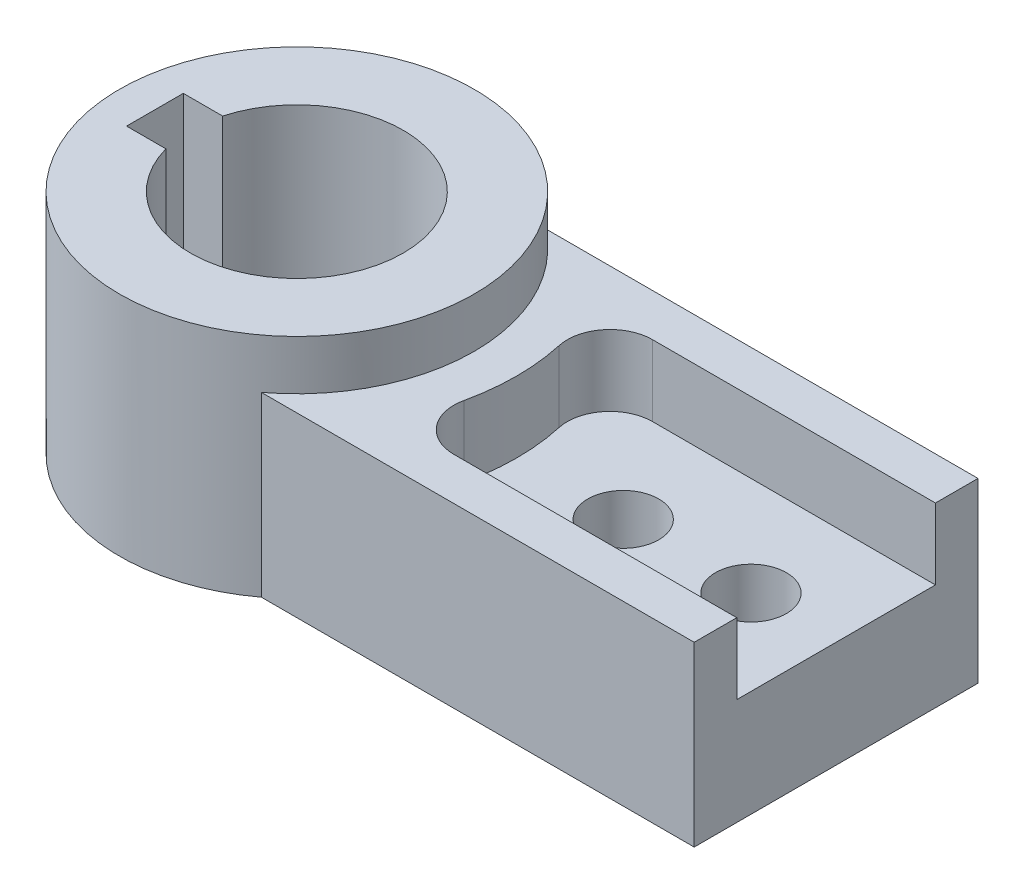
ISO-10303-21;
HEADER;
FILE_DESCRIPTION(('STEP AP214'),'2;1');
FILE_NAME('part.step','',(''),(''),'','','');
FILE_SCHEMA(('AUTOMOTIVE_DESIGN { 1 0 10303 214 1 1 1 1 }'));
ENDSEC;
DATA;
#1=APPLICATION_CONTEXT('core data for automotive mechanical design processes');
#2=APPLICATION_PROTOCOL_DEFINITION('international standard','automotive_design',2000,#1);
#3=PRODUCT_CONTEXT('',#1,'mechanical');
#4=PRODUCT('Part','Part','',(#3));
#5=PRODUCT_RELATED_PRODUCT_CATEGORY('part','',(#4));
#6=PRODUCT_DEFINITION_FORMATION('','',#4);
#7=PRODUCT_DEFINITION_CONTEXT('part definition',#1,'design');
#8=PRODUCT_DEFINITION('design','',#6,#7);
#9=PRODUCT_DEFINITION_SHAPE('','',#8);
#10=(LENGTH_UNIT() NAMED_UNIT(*) SI_UNIT(.MILLI.,.METRE.));
#11=(NAMED_UNIT(*) PLANE_ANGLE_UNIT() SI_UNIT($,.RADIAN.));
#12=(NAMED_UNIT(*) SI_UNIT($,.STERADIAN.) SOLID_ANGLE_UNIT());
#13=UNCERTAINTY_MEASURE_WITH_UNIT(LENGTH_MEASURE(1.E-05),#10,'distance_accuracy_value','');
#14=(GEOMETRIC_REPRESENTATION_CONTEXT(3) GLOBAL_UNCERTAINTY_ASSIGNED_CONTEXT((#13)) GLOBAL_UNIT_ASSIGNED_CONTEXT((#10,
#11,#12)) REPRESENTATION_CONTEXT('',''));
#15=CARTESIAN_POINT('',(0.,0.,0.));
#16=DIRECTION('',(0.,0.,1.));
#17=DIRECTION('',(1.,0.,0.));
#18=AXIS2_PLACEMENT_3D('',#15,#16,#17);
#19=CARTESIAN_POINT('',(0.,32.,0.));
#20=DIRECTION('',(0.,-1.,0.));
#21=DIRECTION('',(0.,0.,-1.));
#22=AXIS2_PLACEMENT_3D('',#19,#20,#21);
#23=CYLINDRICAL_SURFACE('',#22,25.);
#24=CARTESIAN_POINT('',(0.,32.,0.));
#25=DIRECTION('',(0.,1.,0.));
#26=DIRECTION('',(0.,0.,1.));
#27=AXIS2_PLACEMENT_3D('',#24,#25,#26);
#28=CIRCLE('',#27,25.);
#29=CARTESIAN_POINT('',(0.,32.,25.));
#30=VERTEX_POINT('',#29);
#31=EDGE_CURVE('E182',#30,#30,#28,.T.);
#32=ORIENTED_EDGE('',*,*,#31,.F.);
#33=EDGE_LOOP('',(#32));
#34=FACE_BOUND('',#33,.T.);
#35=DIRECTION('',(0.,-1.,0.));
#36=VECTOR('',#35,1.);
#37=CARTESIAN_POINT('',(15.,25.,-20.));
#38=LINE('',#37,#36);
#39=CARTESIAN_POINT('',(15.,25.,-20.));
#40=VERTEX_POINT('',#39);
#41=CARTESIAN_POINT('',(15.,0.,-20.));
#42=VERTEX_POINT('',#41);
#43=EDGE_CURVE('E228',#40,#42,#38,.T.);
#44=ORIENTED_EDGE('',*,*,#43,.T.);
#45=CARTESIAN_POINT('',(0.,0.,0.));
#46=DIRECTION('',(0.,1.,0.));
#47=DIRECTION('',(0.,0.,1.));
#48=AXIS2_PLACEMENT_3D('',#45,#46,#47);
#49=CIRCLE('',#48,25.);
#50=CARTESIAN_POINT('',(15.,0.,20.));
#51=VERTEX_POINT('',#50);
#52=EDGE_CURVE('E174',#42,#51,#49,.T.);
#53=ORIENTED_EDGE('',*,*,#52,.T.);
#54=DIRECTION('',(0.,-1.,0.));
#55=VECTOR('',#54,1.);
#56=CARTESIAN_POINT('',(15.,25.,20.));
#57=LINE('',#56,#55);
#58=CARTESIAN_POINT('',(15.,25.,20.));
#59=VERTEX_POINT('',#58);
#60=EDGE_CURVE('E237',#59,#51,#57,.T.);
#61=ORIENTED_EDGE('',*,*,#60,.F.);
#62=CARTESIAN_POINT('',(0.,25.,0.));
#63=DIRECTION('',(0.,1.,0.));
#64=DIRECTION('',(0.,0.,1.));
#65=AXIS2_PLACEMENT_3D('',#62,#63,#64);
#66=CIRCLE('',#65,25.);
#67=EDGE_CURVE('E232',#59,#40,#66,.T.);
#68=ORIENTED_EDGE('',*,*,#67,.T.);
#69=EDGE_LOOP('',(#44,#53,#61,#68));
#70=FACE_BOUND('',#69,.T.);
#71=ADVANCED_FACE('F41',(#34,#70),#23,.T.);
#72=CARTESIAN_POINT('',(0.,32.,4.));
#73=DIRECTION('',(0.,0.,-1.));
#74=DIRECTION('',(-1.,0.,0.));
#75=AXIS2_PLACEMENT_3D('',#72,#73,#74);
#76=PLANE('',#75);
#77=DIRECTION('',(1.,0.,0.));
#78=VECTOR('',#77,1.);
#79=CARTESIAN_POINT('',(0.,0.,4.));
#80=LINE('',#79,#78);
#81=CARTESIAN_POINT('',(-20.,0.,4.));
#82=VERTEX_POINT('',#81);
#83=CARTESIAN_POINT('',(-14.456832294801,0.,4.));
#84=VERTEX_POINT('',#83);
#85=EDGE_CURVE('E161',#82,#84,#80,.T.);
#86=ORIENTED_EDGE('',*,*,#85,.F.);
#87=DIRECTION('',(0.,-1.,0.));
#88=VECTOR('',#87,1.);
#89=CARTESIAN_POINT('',(-20.,32.,4.));
#90=LINE('',#89,#88);
#91=CARTESIAN_POINT('',(-20.,32.,4.));
#92=VERTEX_POINT('',#91);
#93=EDGE_CURVE('E11',#92,#82,#90,.T.);
#94=ORIENTED_EDGE('',*,*,#93,.F.);
#95=DIRECTION('',(1.,0.,0.));
#96=VECTOR('',#95,1.);
#97=CARTESIAN_POINT('',(0.,32.,4.));
#98=LINE('',#97,#96);
#99=CARTESIAN_POINT('',(-14.456832294801,32.,4.));
#100=VERTEX_POINT('',#99);
#101=EDGE_CURVE('E170',#92,#100,#98,.T.);
#102=ORIENTED_EDGE('',*,*,#101,.T.);
#103=DIRECTION('',(0.,-1.,0.));
#104=VECTOR('',#103,1.);
#105=CARTESIAN_POINT('',(-14.456832294801,32.,4.));
#106=LINE('',#105,#104);
#107=EDGE_CURVE('E184',#100,#84,#106,.T.);
#108=ORIENTED_EDGE('',*,*,#107,.T.);
#109=EDGE_LOOP('',(#86,#94,#102,#108));
#110=FACE_BOUND('',#109,.T.);
#111=ADVANCED_FACE('F43',(#110),#76,.T.);
#112=CARTESIAN_POINT('',(-20.,32.,0.));
#113=DIRECTION('',(1.,0.,0.));
#114=DIRECTION('',(0.,0.,-1.));
#115=AXIS2_PLACEMENT_3D('',#112,#113,#114);
#116=PLANE('',#115);
#117=DIRECTION('',(0.,0.,1.));
#118=VECTOR('',#117,1.);
#119=CARTESIAN_POINT('',(-20.,0.,0.));
#120=LINE('',#119,#118);
#121=CARTESIAN_POINT('',(-20.,0.,-4.));
#122=VERTEX_POINT('',#121);
#123=EDGE_CURVE('E164',#122,#82,#120,.T.);
#124=ORIENTED_EDGE('',*,*,#123,.F.);
#125=DIRECTION('',(0.,-1.,0.));
#126=VECTOR('',#125,1.);
#127=CARTESIAN_POINT('',(-20.,32.,-4.));
#128=LINE('',#127,#126);
#129=CARTESIAN_POINT('',(-20.,32.,-4.));
#130=VERTEX_POINT('',#129);
#131=EDGE_CURVE('E49',#130,#122,#128,.T.);
#132=ORIENTED_EDGE('',*,*,#131,.F.);
#133=DIRECTION('',(0.,0.,1.));
#134=VECTOR('',#133,1.);
#135=CARTESIAN_POINT('',(-20.,32.,0.));
#136=LINE('',#135,#134);
#137=EDGE_CURVE('E173',#130,#92,#136,.T.);
#138=ORIENTED_EDGE('',*,*,#137,.T.);
#139=ORIENTED_EDGE('',*,*,#93,.T.);
#140=EDGE_LOOP('',(#124,#132,#138,#139));
#141=FACE_BOUND('',#140,.T.);
#142=ADVANCED_FACE('F209',(#141),#116,.T.);
#143=CARTESIAN_POINT('',(0.,32.,-4.));
#144=DIRECTION('',(0.,0.,-1.));
#145=DIRECTION('',(-1.,0.,0.));
#146=AXIS2_PLACEMENT_3D('',#143,#144,#145);
#147=PLANE('',#146);
#148=DIRECTION('',(1.,0.,0.));
#149=VECTOR('',#148,1.);
#150=CARTESIAN_POINT('',(0.,0.,-4.));
#151=LINE('',#150,#149);
#152=CARTESIAN_POINT('',(-14.456832294801,0.,-4.));
#153=VERTEX_POINT('',#152);
#154=EDGE_CURVE('E188',#122,#153,#151,.T.);
#155=ORIENTED_EDGE('',*,*,#154,.T.);
#156=DIRECTION('',(0.,-1.,0.));
#157=VECTOR('',#156,1.);
#158=CARTESIAN_POINT('',(-14.456832294801,32.,-4.));
#159=LINE('',#158,#157);
#160=CARTESIAN_POINT('',(-14.456832294801,32.,-4.));
#161=VERTEX_POINT('',#160);
#162=EDGE_CURVE('E196',#161,#153,#159,.T.);
#163=ORIENTED_EDGE('',*,*,#162,.F.);
#164=DIRECTION('',(1.,0.,0.));
#165=VECTOR('',#164,1.);
#166=CARTESIAN_POINT('',(0.,32.,-4.));
#167=LINE('',#166,#165);
#168=EDGE_CURVE('E177',#130,#161,#167,.T.);
#169=ORIENTED_EDGE('',*,*,#168,.F.);
#170=ORIENTED_EDGE('',*,*,#131,.T.);
#171=EDGE_LOOP('',(#155,#163,#169,#170));
#172=FACE_BOUND('',#171,.T.);
#173=ADVANCED_FACE('F200',(#172),#147,.F.);
#174=CARTESIAN_POINT('',(0.,32.,0.));
#175=DIRECTION('',(0.,-1.,0.));
#176=DIRECTION('',(0.,0.,-1.));
#177=AXIS2_PLACEMENT_3D('',#174,#175,#176);
#178=CYLINDRICAL_SURFACE('',#177,15.);
#179=CARTESIAN_POINT('',(0.,0.,0.));
#180=DIRECTION('',(0.,1.,0.));
#181=DIRECTION('',(0.,0.,1.));
#182=AXIS2_PLACEMENT_3D('',#179,#180,#181);
#183=CIRCLE('',#182,15.);
#184=EDGE_CURVE('E191',#84,#153,#183,.T.);
#185=ORIENTED_EDGE('',*,*,#184,.F.);
#186=ORIENTED_EDGE('',*,*,#107,.F.);
#187=CARTESIAN_POINT('',(0.,32.,0.));
#188=DIRECTION('',(0.,1.,0.));
#189=DIRECTION('',(0.,0.,1.));
#190=AXIS2_PLACEMENT_3D('',#187,#188,#189);
#191=CIRCLE('',#190,15.);
#192=EDGE_CURVE('E179',#100,#161,#191,.T.);
#193=ORIENTED_EDGE('',*,*,#192,.T.);
#194=ORIENTED_EDGE('',*,*,#162,.T.);
#195=EDGE_LOOP('',(#185,#186,#193,#194));
#196=FACE_BOUND('',#195,.T.);
#197=ADVANCED_FACE('F214',(#196),#178,.F.);
#198=CARTESIAN_POINT('',(0.,32.,0.));
#199=DIRECTION('',(0.,1.,0.));
#200=DIRECTION('',(0.,0.,1.));
#201=AXIS2_PLACEMENT_3D('',#198,#199,#200);
#202=PLANE('',#201);
#203=ORIENTED_EDGE('',*,*,#101,.F.);
#204=ORIENTED_EDGE('',*,*,#137,.F.);
#205=ORIENTED_EDGE('',*,*,#168,.T.);
#206=ORIENTED_EDGE('',*,*,#192,.F.);
#207=EDGE_LOOP('',(#203,#204,#205,#206));
#208=FACE_BOUND('',#207,.T.);
#209=ORIENTED_EDGE('',*,*,#31,.T.);
#210=EDGE_LOOP('',(#209));
#211=FACE_BOUND('',#210,.T.);
#212=ADVANCED_FACE('F217',(#208,#211),#202,.T.);
#213=CARTESIAN_POINT('',(0.,0.,0.));
#214=DIRECTION('',(0.,1.,0.));
#215=DIRECTION('',(0.,0.,1.));
#216=AXIS2_PLACEMENT_3D('',#213,#214,#215);
#217=PLANE('',#216);
#218=ORIENTED_EDGE('',*,*,#85,.T.);
#219=ORIENTED_EDGE('',*,*,#184,.T.);
#220=ORIENTED_EDGE('',*,*,#154,.F.);
#221=ORIENTED_EDGE('',*,*,#123,.T.);
#222=EDGE_LOOP('',(#218,#219,#220,#221));
#223=FACE_BOUND('',#222,.T.);
#224=ORIENTED_EDGE('',*,*,#52,.F.);
#225=DIRECTION('',(-1.,0.,0.));
#226=VECTOR('',#225,1.);
#227=CARTESIAN_POINT('',(0.,0.,-20.));
#228=LINE('',#227,#226);
#229=CARTESIAN_POINT('',(76.,0.,-20.));
#230=VERTEX_POINT('',#229);
#231=EDGE_CURVE('E241',#230,#42,#228,.T.);
#232=ORIENTED_EDGE('',*,*,#231,.F.);
#233=DIRECTION('',(0.,0.,1.));
#234=VECTOR('',#233,1.);
#235=CARTESIAN_POINT('',(76.,0.,0.));
#236=LINE('',#235,#234);
#237=CARTESIAN_POINT('',(76.,0.,20.));
#238=VERTEX_POINT('',#237);
#239=EDGE_CURVE('E158',#230,#238,#236,.T.);
#240=ORIENTED_EDGE('',*,*,#239,.T.);
#241=DIRECTION('',(-1.,0.,0.));
#242=VECTOR('',#241,1.);
#243=CARTESIAN_POINT('',(0.,0.,20.));
#244=LINE('',#243,#242);
#245=EDGE_CURVE('E244',#238,#51,#244,.T.);
#246=ORIENTED_EDGE('',*,*,#245,.T.);
#247=EDGE_LOOP('',(#224,#232,#240,#246));
#248=FACE_BOUND('',#247,.T.);
#249=CARTESIAN_POINT('',(64.,0.,0.));
#250=DIRECTION('',(0.,1.,0.));
#251=DIRECTION('',(0.,0.,1.));
#252=AXIS2_PLACEMENT_3D('',#249,#250,#251);
#253=CIRCLE('',#252,5.);
#254=CARTESIAN_POINT('',(64.,0.,5.));
#255=VERTEX_POINT('',#254);
#256=EDGE_CURVE('E295',#255,#255,#253,.T.);
#257=ORIENTED_EDGE('',*,*,#256,.T.);
#258=EDGE_LOOP('',(#257));
#259=FACE_BOUND('',#258,.T.);
#260=CARTESIAN_POINT('',(46.,0.,0.));
#261=DIRECTION('',(0.,1.,0.));
#262=DIRECTION('',(0.,0.,1.));
#263=AXIS2_PLACEMENT_3D('',#260,#261,#262);
#264=CIRCLE('',#263,5.);
#265=CARTESIAN_POINT('',(46.,0.,5.));
#266=VERTEX_POINT('',#265);
#267=EDGE_CURVE('E286',#266,#266,#264,.T.);
#268=ORIENTED_EDGE('',*,*,#267,.T.);
#269=EDGE_LOOP('',(#268));
#270=FACE_BOUND('',#269,.T.);
#271=ADVANCED_FACE('F206',(#223,#248,#259,#270),#217,.F.);
#272=CARTESIAN_POINT('',(36.1247837363769,25.,7.99999999999999));
#273=DIRECTION('',(0.,-1.,0.));
#274=DIRECTION('',(0.,0.,-1.));
#275=AXIS2_PLACEMENT_3D('',#272,#273,#274);
#276=CYLINDRICAL_SURFACE('',#275,6.);
#277=DIRECTION('',(0.,-1.,0.));
#278=VECTOR('',#277,1.);
#279=CARTESIAN_POINT('',(36.1247837363769,25.,14.));
#280=LINE('',#279,#278);
#281=CARTESIAN_POINT('',(36.1247837363769,25.,14.));
#282=VERTEX_POINT('',#281);
#283=CARTESIAN_POINT('',(36.1247837363769,15.,14.));
#284=VERTEX_POINT('',#283);
#285=EDGE_CURVE('E256',#282,#284,#280,.T.);
#286=ORIENTED_EDGE('',*,*,#285,.T.);
#287=CARTESIAN_POINT('',(36.1247837363769,15.,7.99999999999999));
#288=DIRECTION('',(0.,1.,0.));
#289=DIRECTION('',(0.,0.,1.));
#290=AXIS2_PLACEMENT_3D('',#287,#288,#289);
#291=CIRCLE('',#290,6.);
#292=CARTESIAN_POINT('',(30.2667106980455,15.,6.7027027027027));
#293=VERTEX_POINT('',#292);
#294=EDGE_CURVE('E56',#284,#293,#291,.F.);
#295=ORIENTED_EDGE('',*,*,#294,.T.);
#296=DIRECTION('',(0.,-1.,0.));
#297=VECTOR('',#296,1.);
#298=CARTESIAN_POINT('',(30.2667106980455,25.,6.7027027027027));
#299=LINE('',#298,#297);
#300=CARTESIAN_POINT('',(30.2667106980455,25.,6.7027027027027));
#301=VERTEX_POINT('',#300);
#302=EDGE_CURVE('E144',#301,#293,#299,.T.);
#303=ORIENTED_EDGE('',*,*,#302,.F.);
#304=CARTESIAN_POINT('',(36.1247837363769,25.,7.99999999999999));
#305=DIRECTION('',(0.,1.,0.));
#306=DIRECTION('',(0.,0.,1.));
#307=AXIS2_PLACEMENT_3D('',#304,#305,#306);
#308=CIRCLE('',#307,6.);
#309=EDGE_CURVE('E150',#282,#301,#308,.F.);
#310=ORIENTED_EDGE('',*,*,#309,.F.);
#311=EDGE_LOOP('',(#286,#295,#303,#310));
#312=FACE_BOUND('',#311,.T.);
#313=ADVANCED_FACE('F160',(#312),#276,.F.);
#314=CARTESIAN_POINT('',(0.,25.,0.));
#315=DIRECTION('',(0.,-1.,0.));
#316=DIRECTION('',(0.,0.,-1.));
#317=AXIS2_PLACEMENT_3D('',#314,#315,#316);
#318=CYLINDRICAL_SURFACE('',#317,31.);
#319=ORIENTED_EDGE('',*,*,#302,.T.);
#320=CARTESIAN_POINT('',(0.,15.,0.));
#321=DIRECTION('',(0.,1.,0.));
#322=DIRECTION('',(0.,0.,1.));
#323=AXIS2_PLACEMENT_3D('',#320,#321,#322);
#324=CIRCLE('',#323,31.);
#325=CARTESIAN_POINT('',(30.2667106980455,15.,-6.7027027027027));
#326=VERTEX_POINT('',#325);
#327=EDGE_CURVE('E63',#293,#326,#324,.T.);
#328=ORIENTED_EDGE('',*,*,#327,.T.);
#329=DIRECTION('',(0.,-1.,0.));
#330=VECTOR('',#329,1.);
#331=CARTESIAN_POINT('',(30.2667106980455,25.,-6.7027027027027));
#332=LINE('',#331,#330);
#333=CARTESIAN_POINT('',(30.2667106980455,25.,-6.7027027027027));
#334=VERTEX_POINT('',#333);
#335=EDGE_CURVE('E145',#334,#326,#332,.T.);
#336=ORIENTED_EDGE('',*,*,#335,.F.);
#337=CARTESIAN_POINT('',(0.,25.,0.));
#338=DIRECTION('',(0.,1.,0.));
#339=DIRECTION('',(0.,0.,1.));
#340=AXIS2_PLACEMENT_3D('',#337,#338,#339);
#341=CIRCLE('',#340,31.);
#342=EDGE_CURVE('E141',#301,#334,#341,.T.);
#343=ORIENTED_EDGE('',*,*,#342,.F.);
#344=EDGE_LOOP('',(#319,#328,#336,#343));
#345=FACE_BOUND('',#344,.T.);
#346=ADVANCED_FACE('F143',(#345),#318,.T.);
#347=CARTESIAN_POINT('',(36.1247837363769,25.,-7.99999999999999));
#348=DIRECTION('',(0.,-1.,0.));
#349=DIRECTION('',(0.,0.,-1.));
#350=AXIS2_PLACEMENT_3D('',#347,#348,#349);
#351=CYLINDRICAL_SURFACE('',#350,6.);
#352=CARTESIAN_POINT('',(36.1247837363769,15.,-7.99999999999999));
#353=DIRECTION('',(0.,1.,0.));
#354=DIRECTION('',(0.,0.,1.));
#355=AXIS2_PLACEMENT_3D('',#352,#353,#354);
#356=CIRCLE('',#355,6.);
#357=CARTESIAN_POINT('',(36.1247837363769,15.,-14.));
#358=VERTEX_POINT('',#357);
#359=EDGE_CURVE('E280',#358,#326,#356,.T.);
#360=ORIENTED_EDGE('',*,*,#359,.F.);
#361=DIRECTION('',(0.,-1.,0.));
#362=VECTOR('',#361,1.);
#363=CARTESIAN_POINT('',(36.1247837363769,25.,-14.));
#364=LINE('',#363,#362);
#365=CARTESIAN_POINT('',(36.1247837363769,25.,-14.));
#366=VERTEX_POINT('',#365);
#367=EDGE_CURVE('E166',#366,#358,#364,.T.);
#368=ORIENTED_EDGE('',*,*,#367,.F.);
#369=CARTESIAN_POINT('',(36.1247837363769,25.,-7.99999999999999));
#370=DIRECTION('',(0.,1.,0.));
#371=DIRECTION('',(0.,0.,1.));
#372=AXIS2_PLACEMENT_3D('',#369,#370,#371);
#373=CIRCLE('',#372,6.);
#374=EDGE_CURVE('E149',#366,#334,#373,.T.);
#375=ORIENTED_EDGE('',*,*,#374,.T.);
#376=ORIENTED_EDGE('',*,*,#335,.T.);
#377=EDGE_LOOP('',(#360,#368,#375,#376));
#378=FACE_BOUND('',#377,.T.);
#379=ADVANCED_FACE('F320',(#378),#351,.F.);
#380=CARTESIAN_POINT('',(0.,25.,-14.));
#381=DIRECTION('',(0.,0.,1.));
#382=DIRECTION('',(1.,0.,0.));
#383=AXIS2_PLACEMENT_3D('',#380,#381,#382);
#384=PLANE('',#383);
#385=DIRECTION('',(-1.,0.,0.));
#386=VECTOR('',#385,1.);
#387=CARTESIAN_POINT('',(0.,15.,-14.));
#388=LINE('',#387,#386);
#389=CARTESIAN_POINT('',(76.,15.,-14.));
#390=VERTEX_POINT('',#389);
#391=EDGE_CURVE('E271',#390,#358,#388,.T.);
#392=ORIENTED_EDGE('',*,*,#391,.F.);
#393=DIRECTION('',(0.,-1.,0.));
#394=VECTOR('',#393,1.);
#395=CARTESIAN_POINT('',(76.,25.,-14.));
#396=LINE('',#395,#394);
#397=CARTESIAN_POINT('',(76.,25.,-14.));
#398=VERTEX_POINT('',#397);
#399=EDGE_CURVE('E264',#398,#390,#396,.T.);
#400=ORIENTED_EDGE('',*,*,#399,.F.);
#401=DIRECTION('',(-1.,0.,0.));
#402=VECTOR('',#401,1.);
#403=CARTESIAN_POINT('',(0.,25.,-14.));
#404=LINE('',#403,#402);
#405=EDGE_CURVE('E273',#398,#366,#404,.T.);
#406=ORIENTED_EDGE('',*,*,#405,.T.);
#407=ORIENTED_EDGE('',*,*,#367,.T.);
#408=EDGE_LOOP('',(#392,#400,#406,#407));
#409=FACE_BOUND('',#408,.T.);
#410=ADVANCED_FACE('F270',(#409),#384,.T.);
#411=CARTESIAN_POINT('',(76.,25.,0.));
#412=DIRECTION('',(1.,0.,0.));
#413=DIRECTION('',(0.,0.,-1.));
#414=AXIS2_PLACEMENT_3D('',#411,#412,#413);
#415=PLANE('',#414);
#416=ORIENTED_EDGE('',*,*,#239,.F.);
#417=DIRECTION('',(0.,-1.,0.));
#418=VECTOR('',#417,1.);
#419=CARTESIAN_POINT('',(76.,25.,-20.));
#420=LINE('',#419,#418);
#421=CARTESIAN_POINT('',(76.,25.,-20.));
#422=VERTEX_POINT('',#421);
#423=EDGE_CURVE('E236',#422,#230,#420,.T.);
#424=ORIENTED_EDGE('',*,*,#423,.F.);
#425=DIRECTION('',(0.,0.,1.));
#426=VECTOR('',#425,1.);
#427=CARTESIAN_POINT('',(76.,25.,0.));
#428=LINE('',#427,#426);
#429=EDGE_CURVE('E302',#422,#398,#428,.T.);
#430=ORIENTED_EDGE('',*,*,#429,.T.);
#431=ORIENTED_EDGE('',*,*,#399,.T.);
#432=DIRECTION('',(0.,0.,1.));
#433=VECTOR('',#432,1.);
#434=CARTESIAN_POINT('',(76.,15.,0.));
#435=LINE('',#434,#433);
#436=CARTESIAN_POINT('',(76.,15.,14.));
#437=VERTEX_POINT('',#436);
#438=EDGE_CURVE('E283',#390,#437,#435,.T.);
#439=ORIENTED_EDGE('',*,*,#438,.T.);
#440=DIRECTION('',(0.,-1.,0.));
#441=VECTOR('',#440,1.);
#442=CARTESIAN_POINT('',(76.,25.,14.));
#443=LINE('',#442,#441);
#444=CARTESIAN_POINT('',(76.,25.,14.));
#445=VERTEX_POINT('',#444);
#446=EDGE_CURVE('E258',#445,#437,#443,.T.);
#447=ORIENTED_EDGE('',*,*,#446,.F.);
#448=DIRECTION('',(0.,0.,1.));
#449=VECTOR('',#448,1.);
#450=CARTESIAN_POINT('',(76.,25.,0.));
#451=LINE('',#450,#449);
#452=CARTESIAN_POINT('',(76.,25.,20.));
#453=VERTEX_POINT('',#452);
#454=EDGE_CURVE('E310',#445,#453,#451,.T.);
#455=ORIENTED_EDGE('',*,*,#454,.T.);
#456=DIRECTION('',(0.,-1.,0.));
#457=VECTOR('',#456,1.);
#458=CARTESIAN_POINT('',(76.,25.,20.));
#459=LINE('',#458,#457);
#460=EDGE_CURVE('E260',#453,#238,#459,.T.);
#461=ORIENTED_EDGE('',*,*,#460,.T.);
#462=EDGE_LOOP('',(#416,#424,#430,#431,#439,#447,#455,#461));
#463=FACE_BOUND('',#462,.T.);
#464=ADVANCED_FACE('F313',(#463),#415,.T.);
#465=CARTESIAN_POINT('',(0.,25.,-20.));
#466=DIRECTION('',(0.,0.,1.));
#467=DIRECTION('',(1.,0.,0.));
#468=AXIS2_PLACEMENT_3D('',#465,#466,#467);
#469=PLANE('',#468);
#470=ORIENTED_EDGE('',*,*,#231,.T.);
#471=ORIENTED_EDGE('',*,*,#43,.F.);
#472=DIRECTION('',(-1.,0.,0.));
#473=VECTOR('',#472,1.);
#474=CARTESIAN_POINT('',(0.,25.,-20.));
#475=LINE('',#474,#473);
#476=EDGE_CURVE('E305',#422,#40,#475,.T.);
#477=ORIENTED_EDGE('',*,*,#476,.F.);
#478=ORIENTED_EDGE('',*,*,#423,.T.);
#479=EDGE_LOOP('',(#470,#471,#477,#478));
#480=FACE_BOUND('',#479,.T.);
#481=ADVANCED_FACE('F242',(#480),#469,.F.);
#482=CARTESIAN_POINT('',(0.,25.,20.));
#483=DIRECTION('',(0.,0.,1.));
#484=DIRECTION('',(1.,0.,0.));
#485=AXIS2_PLACEMENT_3D('',#482,#483,#484);
#486=PLANE('',#485);
#487=ORIENTED_EDGE('',*,*,#245,.F.);
#488=ORIENTED_EDGE('',*,*,#460,.F.);
#489=DIRECTION('',(-1.,0.,0.));
#490=VECTOR('',#489,1.);
#491=CARTESIAN_POINT('',(0.,25.,20.));
#492=LINE('',#491,#490);
#493=EDGE_CURVE('E308',#453,#59,#492,.T.);
#494=ORIENTED_EDGE('',*,*,#493,.T.);
#495=ORIENTED_EDGE('',*,*,#60,.T.);
#496=EDGE_LOOP('',(#487,#488,#494,#495));
#497=FACE_BOUND('',#496,.T.);
#498=ADVANCED_FACE('F317',(#497),#486,.T.);
#499=CARTESIAN_POINT('',(0.,25.,14.));
#500=DIRECTION('',(0.,0.,1.));
#501=DIRECTION('',(1.,0.,0.));
#502=AXIS2_PLACEMENT_3D('',#499,#500,#501);
#503=PLANE('',#502);
#504=ORIENTED_EDGE('',*,*,#446,.T.);
#505=DIRECTION('',(-1.,0.,0.));
#506=VECTOR('',#505,1.);
#507=CARTESIAN_POINT('',(0.,15.,14.));
#508=LINE('',#507,#506);
#509=EDGE_CURVE('E291',#437,#284,#508,.T.);
#510=ORIENTED_EDGE('',*,*,#509,.T.);
#511=ORIENTED_EDGE('',*,*,#285,.F.);
#512=DIRECTION('',(-1.,0.,0.));
#513=VECTOR('',#512,1.);
#514=CARTESIAN_POINT('',(0.,25.,14.));
#515=LINE('',#514,#513);
#516=EDGE_CURVE('E156',#445,#282,#515,.T.);
#517=ORIENTED_EDGE('',*,*,#516,.F.);
#518=EDGE_LOOP('',(#504,#510,#511,#517));
#519=FACE_BOUND('',#518,.T.);
#520=ADVANCED_FACE('F426',(#519),#503,.F.);
#521=CARTESIAN_POINT('',(0.,25.,0.));
#522=DIRECTION('',(0.,1.,0.));
#523=DIRECTION('',(0.,0.,1.));
#524=AXIS2_PLACEMENT_3D('',#521,#522,#523);
#525=PLANE('',#524);
#526=ORIENTED_EDGE('',*,*,#309,.T.);
#527=ORIENTED_EDGE('',*,*,#342,.T.);
#528=ORIENTED_EDGE('',*,*,#374,.F.);
#529=ORIENTED_EDGE('',*,*,#405,.F.);
#530=ORIENTED_EDGE('',*,*,#429,.F.);
#531=ORIENTED_EDGE('',*,*,#476,.T.);
#532=ORIENTED_EDGE('',*,*,#67,.F.);
#533=ORIENTED_EDGE('',*,*,#493,.F.);
#534=ORIENTED_EDGE('',*,*,#454,.F.);
#535=ORIENTED_EDGE('',*,*,#516,.T.);
#536=EDGE_LOOP('',(#526,#527,#528,#529,#530,#531,#532,#533,#534,#535));
#537=FACE_BOUND('',#536,.T.);
#538=ADVANCED_FACE('F153',(#537),#525,.T.);
#539=CARTESIAN_POINT('',(64.,15.,0.));
#540=DIRECTION('',(0.,-1.,0.));
#541=DIRECTION('',(0.,0.,-1.));
#542=AXIS2_PLACEMENT_3D('',#539,#540,#541);
#543=CYLINDRICAL_SURFACE('',#542,5.);
#544=CARTESIAN_POINT('',(64.,15.,0.));
#545=DIRECTION('',(0.,1.,0.));
#546=DIRECTION('',(0.,0.,1.));
#547=AXIS2_PLACEMENT_3D('',#544,#545,#546);
#548=CIRCLE('',#547,5.);
#549=CARTESIAN_POINT('',(64.,15.,5.));
#550=VERTEX_POINT('',#549);
#551=EDGE_CURVE('E250',#550,#550,#548,.T.);
#552=ORIENTED_EDGE('',*,*,#551,.T.);
#553=EDGE_LOOP('',(#552));
#554=FACE_BOUND('',#553,.T.);
#555=ORIENTED_EDGE('',*,*,#256,.F.);
#556=EDGE_LOOP('',(#555));
#557=FACE_BOUND('',#556,.T.);
#558=ADVANCED_FACE('F442',(#554,#557),#543,.F.);
#559=CARTESIAN_POINT('',(46.,15.,0.));
#560=DIRECTION('',(0.,-1.,0.));
#561=DIRECTION('',(0.,0.,-1.));
#562=AXIS2_PLACEMENT_3D('',#559,#560,#561);
#563=CYLINDRICAL_SURFACE('',#562,5.);
#564=CARTESIAN_POINT('',(46.,15.,0.));
#565=DIRECTION('',(0.,1.,0.));
#566=DIRECTION('',(0.,0.,1.));
#567=AXIS2_PLACEMENT_3D('',#564,#565,#566);
#568=CIRCLE('',#567,5.);
#569=CARTESIAN_POINT('',(46.,15.,5.));
#570=VERTEX_POINT('',#569);
#571=EDGE_CURVE('E245',#570,#570,#568,.T.);
#572=ORIENTED_EDGE('',*,*,#571,.T.);
#573=EDGE_LOOP('',(#572));
#574=FACE_BOUND('',#573,.T.);
#575=ORIENTED_EDGE('',*,*,#267,.F.);
#576=EDGE_LOOP('',(#575));
#577=FACE_BOUND('',#576,.T.);
#578=ADVANCED_FACE('F451',(#574,#577),#563,.F.);
#579=CARTESIAN_POINT('',(0.,15.,0.));
#580=DIRECTION('',(0.,1.,0.));
#581=DIRECTION('',(0.,0.,1.));
#582=AXIS2_PLACEMENT_3D('',#579,#580,#581);
#583=PLANE('',#582);
#584=ORIENTED_EDGE('',*,*,#438,.F.);
#585=ORIENTED_EDGE('',*,*,#391,.T.);
#586=ORIENTED_EDGE('',*,*,#359,.T.);
#587=ORIENTED_EDGE('',*,*,#327,.F.);
#588=ORIENTED_EDGE('',*,*,#294,.F.);
#589=ORIENTED_EDGE('',*,*,#509,.F.);
#590=EDGE_LOOP('',(#584,#585,#586,#587,#588,#589));
#591=FACE_BOUND('',#590,.T.);
#592=ORIENTED_EDGE('',*,*,#551,.F.);
#593=EDGE_LOOP('',(#592));
#594=FACE_BOUND('',#593,.T.);
#595=ORIENTED_EDGE('',*,*,#571,.F.);
#596=EDGE_LOOP('',(#595));
#597=FACE_BOUND('',#596,.T.);
#598=ADVANCED_FACE('F278',(#591,#594,#597),#583,.T.);
#599=CLOSED_SHELL('',(#71,#111,#142,#173,#197,#212,#271,#313,#346,#379,#410,#464,#481,#498,#520,
#538,#558,#578,#598));
#600=MANIFOLD_SOLID_BREP('B2',#599);
#601=ADVANCED_BREP_SHAPE_REPRESENTATION('',(#18,#600),#14);
#602=SHAPE_DEFINITION_REPRESENTATION(#9,#601);
ENDSEC;
END-ISO-10303-21;
